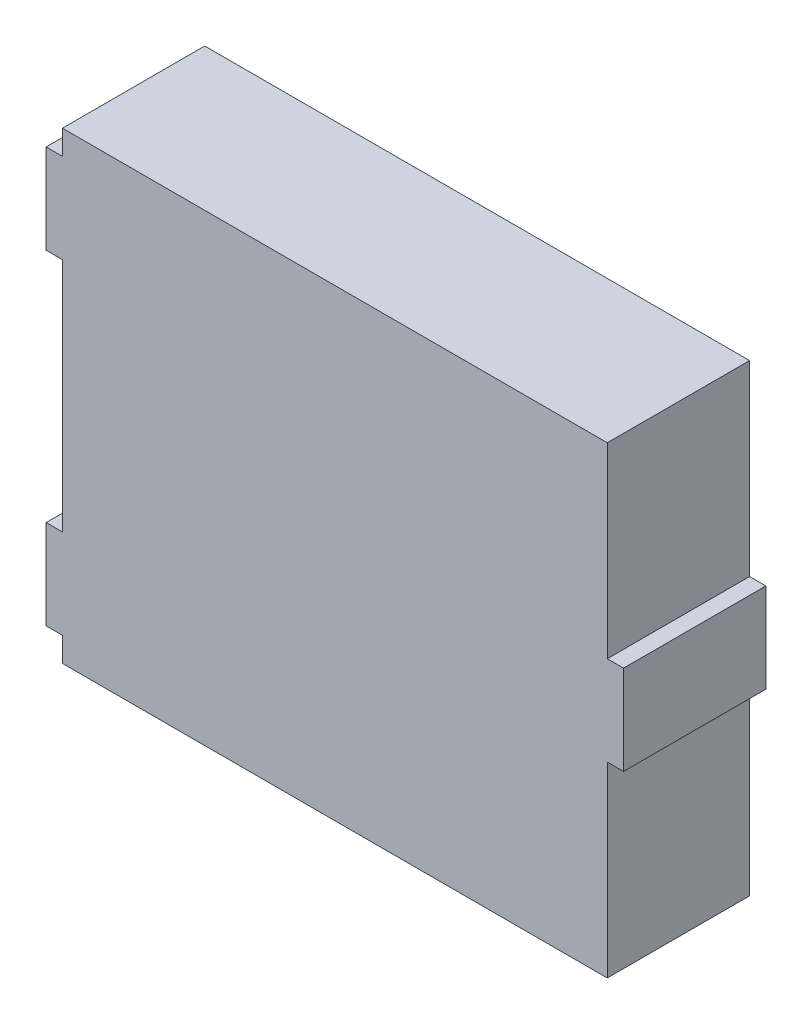
ISO-10303-21;
HEADER;
FILE_DESCRIPTION(('STEP AP214'),'2;1');
FILE_NAME('part.step','',(''),(''),'','','');
FILE_SCHEMA(('AUTOMOTIVE_DESIGN { 1 0 10303 214 1 1 1 1 }'));
ENDSEC;
DATA;
#1=APPLICATION_CONTEXT('core data for automotive mechanical design processes');
#2=APPLICATION_PROTOCOL_DEFINITION('international standard','automotive_design',2000,#1);
#3=PRODUCT_CONTEXT('',#1,'mechanical');
#4=PRODUCT('Part','Part','',(#3));
#5=PRODUCT_RELATED_PRODUCT_CATEGORY('part','',(#4));
#6=PRODUCT_DEFINITION_FORMATION('','',#4);
#7=PRODUCT_DEFINITION_CONTEXT('part definition',#1,'design');
#8=PRODUCT_DEFINITION('design','',#6,#7);
#9=PRODUCT_DEFINITION_SHAPE('','',#8);
#10=(LENGTH_UNIT() NAMED_UNIT(*) SI_UNIT(.MILLI.,.METRE.));
#11=(NAMED_UNIT(*) PLANE_ANGLE_UNIT() SI_UNIT($,.RADIAN.));
#12=(NAMED_UNIT(*) SI_UNIT($,.STERADIAN.) SOLID_ANGLE_UNIT());
#13=UNCERTAINTY_MEASURE_WITH_UNIT(LENGTH_MEASURE(1.E-05),#10,'distance_accuracy_value','');
#14=(GEOMETRIC_REPRESENTATION_CONTEXT(3) GLOBAL_UNCERTAINTY_ASSIGNED_CONTEXT((#13)) GLOBAL_UNIT_ASSIGNED_CONTEXT((#10,
#11,#12)) REPRESENTATION_CONTEXT('',''));
#15=CARTESIAN_POINT('',(0.,0.,0.));
#16=DIRECTION('',(0.,0.,1.));
#17=DIRECTION('',(1.,0.,0.));
#18=AXIS2_PLACEMENT_3D('',#15,#16,#17);
#19=CARTESIAN_POINT('',(3.35,-2.85,1.75));
#20=DIRECTION('',(0.,1.,0.));
#21=DIRECTION('',(0.,0.,1.));
#22=AXIS2_PLACEMENT_3D('',#19,#20,#21);
#23=PLANE('',#22);
#24=DIRECTION('',(1.,0.,0.));
#25=VECTOR('',#24,1.);
#26=CARTESIAN_POINT('',(3.35,-2.85,0.));
#27=LINE('',#26,#25);
#28=CARTESIAN_POINT('',(-3.35,-2.85,0.));
#29=VERTEX_POINT('',#28);
#30=CARTESIAN_POINT('',(3.35,-2.85,0.));
#31=VERTEX_POINT('',#30);
#32=EDGE_CURVE('E178',#29,#31,#27,.T.);
#33=ORIENTED_EDGE('',*,*,#32,.T.);
#34=DIRECTION('',(0.,0.,-1.));
#35=VECTOR('',#34,1.);
#36=CARTESIAN_POINT('',(3.35,-2.85,1.75));
#37=LINE('',#36,#35);
#38=CARTESIAN_POINT('',(3.35,-2.85,1.75));
#39=VERTEX_POINT('',#38);
#40=EDGE_CURVE('E11',#39,#31,#37,.T.);
#41=ORIENTED_EDGE('',*,*,#40,.F.);
#42=DIRECTION('',(1.,0.,0.));
#43=VECTOR('',#42,1.);
#44=CARTESIAN_POINT('',(3.35,-2.85,1.75));
#45=LINE('',#44,#43);
#46=CARTESIAN_POINT('',(-3.35,-2.85,1.75));
#47=VERTEX_POINT('',#46);
#48=EDGE_CURVE('E208',#47,#39,#45,.T.);
#49=ORIENTED_EDGE('',*,*,#48,.F.);
#50=DIRECTION('',(0.,0.,-1.));
#51=VECTOR('',#50,1.);
#52=CARTESIAN_POINT('',(-3.35,-2.85,1.75));
#53=LINE('',#52,#51);
#54=EDGE_CURVE('E174',#47,#29,#53,.T.);
#55=ORIENTED_EDGE('',*,*,#54,.T.);
#56=EDGE_LOOP('',(#33,#41,#49,#55));
#57=FACE_BOUND('',#56,.T.);
#58=ADVANCED_FACE('F34',(#57),#23,.F.);
#59=CARTESIAN_POINT('',(3.35,-0.55,1.75));
#60=DIRECTION('',(-1.,0.,0.));
#61=DIRECTION('',(0.,0.,1.));
#62=AXIS2_PLACEMENT_3D('',#59,#60,#61);
#63=PLANE('',#62);
#64=DIRECTION('',(0.,1.,0.));
#65=VECTOR('',#64,1.);
#66=CARTESIAN_POINT('',(3.35,-0.55,0.));
#67=LINE('',#66,#65);
#68=CARTESIAN_POINT('',(3.35,-0.55,0.));
#69=VERTEX_POINT('',#68);
#70=EDGE_CURVE('E181',#31,#69,#67,.T.);
#71=ORIENTED_EDGE('',*,*,#70,.T.);
#72=DIRECTION('',(0.,0.,-1.));
#73=VECTOR('',#72,1.);
#74=CARTESIAN_POINT('',(3.35,-0.55,1.75));
#75=LINE('',#74,#73);
#76=CARTESIAN_POINT('',(3.35,-0.55,1.75));
#77=VERTEX_POINT('',#76);
#78=EDGE_CURVE('E42',#77,#69,#75,.T.);
#79=ORIENTED_EDGE('',*,*,#78,.F.);
#80=DIRECTION('',(0.,1.,0.));
#81=VECTOR('',#80,1.);
#82=CARTESIAN_POINT('',(3.35,-0.55,1.75));
#83=LINE('',#82,#81);
#84=EDGE_CURVE('E117',#39,#77,#83,.T.);
#85=ORIENTED_EDGE('',*,*,#84,.F.);
#86=ORIENTED_EDGE('',*,*,#40,.T.);
#87=EDGE_LOOP('',(#71,#79,#85,#86));
#88=FACE_BOUND('',#87,.T.);
#89=ADVANCED_FACE('F306',(#88),#63,.F.);
#90=CARTESIAN_POINT('',(3.55,-0.55,1.75));
#91=DIRECTION('',(0.,1.,0.));
#92=DIRECTION('',(0.,0.,1.));
#93=AXIS2_PLACEMENT_3D('',#90,#91,#92);
#94=PLANE('',#93);
#95=DIRECTION('',(1.,0.,0.));
#96=VECTOR('',#95,1.);
#97=CARTESIAN_POINT('',(3.55,-0.55,0.));
#98=LINE('',#97,#96);
#99=CARTESIAN_POINT('',(3.55,-0.55,0.));
#100=VERTEX_POINT('',#99);
#101=EDGE_CURVE('E183',#69,#100,#98,.T.);
#102=ORIENTED_EDGE('',*,*,#101,.T.);
#103=DIRECTION('',(0.,0.,-1.));
#104=VECTOR('',#103,1.);
#105=CARTESIAN_POINT('',(3.55,-0.55,1.75));
#106=LINE('',#105,#104);
#107=CARTESIAN_POINT('',(3.55,-0.55,1.75));
#108=VERTEX_POINT('',#107);
#109=EDGE_CURVE('E239',#108,#100,#106,.T.);
#110=ORIENTED_EDGE('',*,*,#109,.F.);
#111=DIRECTION('',(1.,0.,0.));
#112=VECTOR('',#111,1.);
#113=CARTESIAN_POINT('',(3.55,-0.55,1.75));
#114=LINE('',#113,#112);
#115=EDGE_CURVE('E247',#77,#108,#114,.T.);
#116=ORIENTED_EDGE('',*,*,#115,.F.);
#117=ORIENTED_EDGE('',*,*,#78,.T.);
#118=EDGE_LOOP('',(#102,#110,#116,#117));
#119=FACE_BOUND('',#118,.T.);
#120=ADVANCED_FACE('F245',(#119),#94,.F.);
#121=CARTESIAN_POINT('',(3.55,0.55,1.75));
#122=DIRECTION('',(-1.,0.,0.));
#123=DIRECTION('',(0.,0.,1.));
#124=AXIS2_PLACEMENT_3D('',#121,#122,#123);
#125=PLANE('',#124);
#126=DIRECTION('',(0.,1.,0.));
#127=VECTOR('',#126,1.);
#128=CARTESIAN_POINT('',(3.55,0.55,0.));
#129=LINE('',#128,#127);
#130=CARTESIAN_POINT('',(3.55,0.55,0.));
#131=VERTEX_POINT('',#130);
#132=EDGE_CURVE('E185',#100,#131,#129,.T.);
#133=ORIENTED_EDGE('',*,*,#132,.T.);
#134=DIRECTION('',(0.,0.,-1.));
#135=VECTOR('',#134,1.);
#136=CARTESIAN_POINT('',(3.55,0.55,1.75));
#137=LINE('',#136,#135);
#138=CARTESIAN_POINT('',(3.55,0.55,1.75));
#139=VERTEX_POINT('',#138);
#140=EDGE_CURVE('E236',#139,#131,#137,.T.);
#141=ORIENTED_EDGE('',*,*,#140,.F.);
#142=DIRECTION('',(0.,1.,0.));
#143=VECTOR('',#142,1.);
#144=CARTESIAN_POINT('',(3.55,0.55,1.75));
#145=LINE('',#144,#143);
#146=EDGE_CURVE('E265',#108,#139,#145,.T.);
#147=ORIENTED_EDGE('',*,*,#146,.F.);
#148=ORIENTED_EDGE('',*,*,#109,.T.);
#149=EDGE_LOOP('',(#133,#141,#147,#148));
#150=FACE_BOUND('',#149,.T.);
#151=ADVANCED_FACE('F256',(#150),#125,.F.);
#152=CARTESIAN_POINT('',(3.35,0.55,1.75));
#153=DIRECTION('',(0.,-1.,0.));
#154=DIRECTION('',(0.,0.,-1.));
#155=AXIS2_PLACEMENT_3D('',#152,#153,#154);
#156=PLANE('',#155);
#157=DIRECTION('',(-1.,0.,0.));
#158=VECTOR('',#157,1.);
#159=CARTESIAN_POINT('',(3.35,0.55,0.));
#160=LINE('',#159,#158);
#161=CARTESIAN_POINT('',(3.35,0.55,0.));
#162=VERTEX_POINT('',#161);
#163=EDGE_CURVE('E187',#131,#162,#160,.T.);
#164=ORIENTED_EDGE('',*,*,#163,.T.);
#165=DIRECTION('',(0.,0.,-1.));
#166=VECTOR('',#165,1.);
#167=CARTESIAN_POINT('',(3.35,0.55,1.75));
#168=LINE('',#167,#166);
#169=CARTESIAN_POINT('',(3.35,0.55,1.75));
#170=VERTEX_POINT('',#169);
#171=EDGE_CURVE('E233',#170,#162,#168,.T.);
#172=ORIENTED_EDGE('',*,*,#171,.F.);
#173=DIRECTION('',(-1.,0.,0.));
#174=VECTOR('',#173,1.);
#175=CARTESIAN_POINT('',(3.35,0.55,1.75));
#176=LINE('',#175,#174);
#177=EDGE_CURVE('E262',#139,#170,#176,.T.);
#178=ORIENTED_EDGE('',*,*,#177,.F.);
#179=ORIENTED_EDGE('',*,*,#140,.T.);
#180=EDGE_LOOP('',(#164,#172,#178,#179));
#181=FACE_BOUND('',#180,.T.);
#182=ADVANCED_FACE('F260',(#181),#156,.F.);
#183=CARTESIAN_POINT('',(3.35,2.85,1.75));
#184=DIRECTION('',(-1.,0.,0.));
#185=DIRECTION('',(0.,0.,1.));
#186=AXIS2_PLACEMENT_3D('',#183,#184,#185);
#187=PLANE('',#186);
#188=DIRECTION('',(0.,1.,0.));
#189=VECTOR('',#188,1.);
#190=CARTESIAN_POINT('',(3.35,2.85,0.));
#191=LINE('',#190,#189);
#192=CARTESIAN_POINT('',(3.35,2.85,0.));
#193=VERTEX_POINT('',#192);
#194=EDGE_CURVE('E189',#162,#193,#191,.T.);
#195=ORIENTED_EDGE('',*,*,#194,.T.);
#196=DIRECTION('',(0.,0.,-1.));
#197=VECTOR('',#196,1.);
#198=CARTESIAN_POINT('',(3.35,2.85,1.75));
#199=LINE('',#198,#197);
#200=CARTESIAN_POINT('',(3.35,2.85,1.75));
#201=VERTEX_POINT('',#200);
#202=EDGE_CURVE('E230',#201,#193,#199,.T.);
#203=ORIENTED_EDGE('',*,*,#202,.F.);
#204=DIRECTION('',(0.,1.,0.));
#205=VECTOR('',#204,1.);
#206=CARTESIAN_POINT('',(3.35,2.85,1.75));
#207=LINE('',#206,#205);
#208=EDGE_CURVE('E264',#170,#201,#207,.T.);
#209=ORIENTED_EDGE('',*,*,#208,.F.);
#210=ORIENTED_EDGE('',*,*,#171,.T.);
#211=EDGE_LOOP('',(#195,#203,#209,#210));
#212=FACE_BOUND('',#211,.T.);
#213=ADVANCED_FACE('F319',(#212),#187,.F.);
#214=CARTESIAN_POINT('',(-3.35,2.85,1.75));
#215=DIRECTION('',(0.,-1.,0.));
#216=DIRECTION('',(0.,0.,-1.));
#217=AXIS2_PLACEMENT_3D('',#214,#215,#216);
#218=PLANE('',#217);
#219=DIRECTION('',(-1.,0.,0.));
#220=VECTOR('',#219,1.);
#221=CARTESIAN_POINT('',(-3.35,2.85,0.));
#222=LINE('',#221,#220);
#223=CARTESIAN_POINT('',(-3.35,2.85,0.));
#224=VERTEX_POINT('',#223);
#225=EDGE_CURVE('E191',#193,#224,#222,.T.);
#226=ORIENTED_EDGE('',*,*,#225,.T.);
#227=DIRECTION('',(0.,0.,-1.));
#228=VECTOR('',#227,1.);
#229=CARTESIAN_POINT('',(-3.35,2.85,1.75));
#230=LINE('',#229,#228);
#231=CARTESIAN_POINT('',(-3.35,2.85,1.75));
#232=VERTEX_POINT('',#231);
#233=EDGE_CURVE('E227',#232,#224,#230,.T.);
#234=ORIENTED_EDGE('',*,*,#233,.F.);
#235=DIRECTION('',(-1.,0.,0.));
#236=VECTOR('',#235,1.);
#237=CARTESIAN_POINT('',(-3.35,2.85,1.75));
#238=LINE('',#237,#236);
#239=EDGE_CURVE('E267',#201,#232,#238,.T.);
#240=ORIENTED_EDGE('',*,*,#239,.F.);
#241=ORIENTED_EDGE('',*,*,#202,.T.);
#242=EDGE_LOOP('',(#226,#234,#240,#241));
#243=FACE_BOUND('',#242,.T.);
#244=ADVANCED_FACE('F322',(#243),#218,.F.);
#245=CARTESIAN_POINT('',(-3.35,2.55,1.75));
#246=DIRECTION('',(1.,0.,0.));
#247=DIRECTION('',(0.,0.,-1.));
#248=AXIS2_PLACEMENT_3D('',#245,#246,#247);
#249=PLANE('',#248);
#250=DIRECTION('',(0.,-1.,0.));
#251=VECTOR('',#250,1.);
#252=CARTESIAN_POINT('',(-3.35,2.55,0.));
#253=LINE('',#252,#251);
#254=CARTESIAN_POINT('',(-3.35,2.55,0.));
#255=VERTEX_POINT('',#254);
#256=EDGE_CURVE('E193',#224,#255,#253,.T.);
#257=ORIENTED_EDGE('',*,*,#256,.T.);
#258=DIRECTION('',(0.,0.,-1.));
#259=VECTOR('',#258,1.);
#260=CARTESIAN_POINT('',(-3.35,2.55,1.75));
#261=LINE('',#260,#259);
#262=CARTESIAN_POINT('',(-3.35,2.55,1.75));
#263=VERTEX_POINT('',#262);
#264=EDGE_CURVE('E224',#263,#255,#261,.T.);
#265=ORIENTED_EDGE('',*,*,#264,.F.);
#266=DIRECTION('',(0.,-1.,0.));
#267=VECTOR('',#266,1.);
#268=CARTESIAN_POINT('',(-3.35,2.55,1.75));
#269=LINE('',#268,#267);
#270=EDGE_CURVE('E273',#232,#263,#269,.T.);
#271=ORIENTED_EDGE('',*,*,#270,.F.);
#272=ORIENTED_EDGE('',*,*,#233,.T.);
#273=EDGE_LOOP('',(#257,#265,#271,#272));
#274=FACE_BOUND('',#273,.T.);
#275=ADVANCED_FACE('F326',(#274),#249,.F.);
#276=CARTESIAN_POINT('',(-3.55,2.55,1.75));
#277=DIRECTION('',(0.,-1.,0.));
#278=DIRECTION('',(0.,0.,-1.));
#279=AXIS2_PLACEMENT_3D('',#276,#277,#278);
#280=PLANE('',#279);
#281=DIRECTION('',(-1.,0.,0.));
#282=VECTOR('',#281,1.);
#283=CARTESIAN_POINT('',(-3.55,2.55,0.));
#284=LINE('',#283,#282);
#285=CARTESIAN_POINT('',(-3.55,2.55,0.));
#286=VERTEX_POINT('',#285);
#287=EDGE_CURVE('E195',#255,#286,#284,.T.);
#288=ORIENTED_EDGE('',*,*,#287,.T.);
#289=DIRECTION('',(0.,0.,-1.));
#290=VECTOR('',#289,1.);
#291=CARTESIAN_POINT('',(-3.55,2.55,1.75));
#292=LINE('',#291,#290);
#293=CARTESIAN_POINT('',(-3.55,2.55,1.75));
#294=VERTEX_POINT('',#293);
#295=EDGE_CURVE('E221',#294,#286,#292,.T.);
#296=ORIENTED_EDGE('',*,*,#295,.F.);
#297=DIRECTION('',(-1.,0.,0.));
#298=VECTOR('',#297,1.);
#299=CARTESIAN_POINT('',(-3.55,2.55,1.75));
#300=LINE('',#299,#298);
#301=EDGE_CURVE('E275',#263,#294,#300,.T.);
#302=ORIENTED_EDGE('',*,*,#301,.F.);
#303=ORIENTED_EDGE('',*,*,#264,.T.);
#304=EDGE_LOOP('',(#288,#296,#302,#303));
#305=FACE_BOUND('',#304,.T.);
#306=ADVANCED_FACE('F330',(#305),#280,.F.);
#307=CARTESIAN_POINT('',(-3.55,1.45,1.75));
#308=DIRECTION('',(1.,0.,0.));
#309=DIRECTION('',(0.,0.,-1.));
#310=AXIS2_PLACEMENT_3D('',#307,#308,#309);
#311=PLANE('',#310);
#312=DIRECTION('',(0.,-1.,0.));
#313=VECTOR('',#312,1.);
#314=CARTESIAN_POINT('',(-3.55,1.45,0.));
#315=LINE('',#314,#313);
#316=CARTESIAN_POINT('',(-3.55,1.45,0.));
#317=VERTEX_POINT('',#316);
#318=EDGE_CURVE('E197',#286,#317,#315,.T.);
#319=ORIENTED_EDGE('',*,*,#318,.T.);
#320=DIRECTION('',(0.,0.,-1.));
#321=VECTOR('',#320,1.);
#322=CARTESIAN_POINT('',(-3.55,1.45,1.75));
#323=LINE('',#322,#321);
#324=CARTESIAN_POINT('',(-3.55,1.45,1.75));
#325=VERTEX_POINT('',#324);
#326=EDGE_CURVE('E218',#325,#317,#323,.T.);
#327=ORIENTED_EDGE('',*,*,#326,.F.);
#328=DIRECTION('',(0.,-1.,0.));
#329=VECTOR('',#328,1.);
#330=CARTESIAN_POINT('',(-3.55,1.45,1.75));
#331=LINE('',#330,#329);
#332=EDGE_CURVE('E277',#294,#325,#331,.T.);
#333=ORIENTED_EDGE('',*,*,#332,.F.);
#334=ORIENTED_EDGE('',*,*,#295,.T.);
#335=EDGE_LOOP('',(#319,#327,#333,#334));
#336=FACE_BOUND('',#335,.T.);
#337=ADVANCED_FACE('F334',(#336),#311,.F.);
#338=CARTESIAN_POINT('',(-3.35,1.45,1.75));
#339=DIRECTION('',(0.,1.,0.));
#340=DIRECTION('',(0.,0.,1.));
#341=AXIS2_PLACEMENT_3D('',#338,#339,#340);
#342=PLANE('',#341);
#343=DIRECTION('',(1.,0.,0.));
#344=VECTOR('',#343,1.);
#345=CARTESIAN_POINT('',(-3.35,1.45,0.));
#346=LINE('',#345,#344);
#347=CARTESIAN_POINT('',(-3.35,1.45,0.));
#348=VERTEX_POINT('',#347);
#349=EDGE_CURVE('E199',#317,#348,#346,.T.);
#350=ORIENTED_EDGE('',*,*,#349,.T.);
#351=DIRECTION('',(0.,0.,-1.));
#352=VECTOR('',#351,1.);
#353=CARTESIAN_POINT('',(-3.35,1.45,1.75));
#354=LINE('',#353,#352);
#355=CARTESIAN_POINT('',(-3.35,1.45,1.75));
#356=VERTEX_POINT('',#355);
#357=EDGE_CURVE('E215',#356,#348,#354,.T.);
#358=ORIENTED_EDGE('',*,*,#357,.F.);
#359=DIRECTION('',(1.,0.,0.));
#360=VECTOR('',#359,1.);
#361=CARTESIAN_POINT('',(-3.35,1.45,1.75));
#362=LINE('',#361,#360);
#363=EDGE_CURVE('E279',#325,#356,#362,.T.);
#364=ORIENTED_EDGE('',*,*,#363,.F.);
#365=ORIENTED_EDGE('',*,*,#326,.T.);
#366=EDGE_LOOP('',(#350,#358,#364,#365));
#367=FACE_BOUND('',#366,.T.);
#368=ADVANCED_FACE('F338',(#367),#342,.F.);
#369=CARTESIAN_POINT('',(-3.35,-1.45,1.75));
#370=DIRECTION('',(1.,0.,0.));
#371=DIRECTION('',(0.,0.,-1.));
#372=AXIS2_PLACEMENT_3D('',#369,#370,#371);
#373=PLANE('',#372);
#374=DIRECTION('',(0.,-1.,0.));
#375=VECTOR('',#374,1.);
#376=CARTESIAN_POINT('',(-3.35,-1.45,0.));
#377=LINE('',#376,#375);
#378=CARTESIAN_POINT('',(-3.35,-1.45,0.));
#379=VERTEX_POINT('',#378);
#380=EDGE_CURVE('E201',#348,#379,#377,.T.);
#381=ORIENTED_EDGE('',*,*,#380,.T.);
#382=DIRECTION('',(0.,0.,-1.));
#383=VECTOR('',#382,1.);
#384=CARTESIAN_POINT('',(-3.35,-1.45,1.75));
#385=LINE('',#384,#383);
#386=CARTESIAN_POINT('',(-3.35,-1.45,1.75));
#387=VERTEX_POINT('',#386);
#388=EDGE_CURVE('E212',#387,#379,#385,.T.);
#389=ORIENTED_EDGE('',*,*,#388,.F.);
#390=DIRECTION('',(0.,-1.,0.));
#391=VECTOR('',#390,1.);
#392=CARTESIAN_POINT('',(-3.35,-1.45,1.75));
#393=LINE('',#392,#391);
#394=EDGE_CURVE('E281',#356,#387,#393,.T.);
#395=ORIENTED_EDGE('',*,*,#394,.F.);
#396=ORIENTED_EDGE('',*,*,#357,.T.);
#397=EDGE_LOOP('',(#381,#389,#395,#396));
#398=FACE_BOUND('',#397,.T.);
#399=ADVANCED_FACE('F287',(#398),#373,.F.);
#400=CARTESIAN_POINT('',(-3.55,-1.45,1.75));
#401=DIRECTION('',(0.,-1.,0.));
#402=DIRECTION('',(0.,0.,-1.));
#403=AXIS2_PLACEMENT_3D('',#400,#401,#402);
#404=PLANE('',#403);
#405=DIRECTION('',(-1.,0.,0.));
#406=VECTOR('',#405,1.);
#407=CARTESIAN_POINT('',(-3.55,-1.45,0.));
#408=LINE('',#407,#406);
#409=CARTESIAN_POINT('',(-3.55,-1.45,0.));
#410=VERTEX_POINT('',#409);
#411=EDGE_CURVE('E203',#379,#410,#408,.T.);
#412=ORIENTED_EDGE('',*,*,#411,.T.);
#413=DIRECTION('',(0.,0.,-1.));
#414=VECTOR('',#413,1.);
#415=CARTESIAN_POINT('',(-3.55,-1.45,1.75));
#416=LINE('',#415,#414);
#417=CARTESIAN_POINT('',(-3.55,-1.45,1.75));
#418=VERTEX_POINT('',#417);
#419=EDGE_CURVE('E169',#418,#410,#416,.T.);
#420=ORIENTED_EDGE('',*,*,#419,.F.);
#421=DIRECTION('',(-1.,0.,0.));
#422=VECTOR('',#421,1.);
#423=CARTESIAN_POINT('',(-3.55,-1.45,1.75));
#424=LINE('',#423,#422);
#425=EDGE_CURVE('E160',#387,#418,#424,.T.);
#426=ORIENTED_EDGE('',*,*,#425,.F.);
#427=ORIENTED_EDGE('',*,*,#388,.T.);
#428=EDGE_LOOP('',(#412,#420,#426,#427));
#429=FACE_BOUND('',#428,.T.);
#430=ADVANCED_FACE('F291',(#429),#404,.F.);
#431=CARTESIAN_POINT('',(-3.55,-2.55,1.75));
#432=DIRECTION('',(1.,0.,0.));
#433=DIRECTION('',(0.,0.,-1.));
#434=AXIS2_PLACEMENT_3D('',#431,#432,#433);
#435=PLANE('',#434);
#436=DIRECTION('',(0.,-1.,0.));
#437=VECTOR('',#436,1.);
#438=CARTESIAN_POINT('',(-3.55,-2.55,0.));
#439=LINE('',#438,#437);
#440=CARTESIAN_POINT('',(-3.55,-2.55,0.));
#441=VERTEX_POINT('',#440);
#442=EDGE_CURVE('E168',#410,#441,#439,.T.);
#443=ORIENTED_EDGE('',*,*,#442,.T.);
#444=DIRECTION('',(0.,0.,-1.));
#445=VECTOR('',#444,1.);
#446=CARTESIAN_POINT('',(-3.55,-2.55,1.75));
#447=LINE('',#446,#445);
#448=CARTESIAN_POINT('',(-3.55,-2.55,1.75));
#449=VERTEX_POINT('',#448);
#450=EDGE_CURVE('E165',#449,#441,#447,.T.);
#451=ORIENTED_EDGE('',*,*,#450,.F.);
#452=DIRECTION('',(0.,-1.,0.));
#453=VECTOR('',#452,1.);
#454=CARTESIAN_POINT('',(-3.55,-2.55,1.75));
#455=LINE('',#454,#453);
#456=EDGE_CURVE('E154',#418,#449,#455,.T.);
#457=ORIENTED_EDGE('',*,*,#456,.F.);
#458=ORIENTED_EDGE('',*,*,#419,.T.);
#459=EDGE_LOOP('',(#443,#451,#457,#458));
#460=FACE_BOUND('',#459,.T.);
#461=ADVANCED_FACE('F166',(#460),#435,.F.);
#462=CARTESIAN_POINT('',(-3.35,-2.55,1.75));
#463=DIRECTION('',(0.,1.,0.));
#464=DIRECTION('',(0.,0.,1.));
#465=AXIS2_PLACEMENT_3D('',#462,#463,#464);
#466=PLANE('',#465);
#467=DIRECTION('',(1.,0.,0.));
#468=VECTOR('',#467,1.);
#469=CARTESIAN_POINT('',(-3.35,-2.55,0.));
#470=LINE('',#469,#468);
#471=CARTESIAN_POINT('',(-3.35,-2.55,0.));
#472=VERTEX_POINT('',#471);
#473=EDGE_CURVE('E103',#441,#472,#470,.T.);
#474=ORIENTED_EDGE('',*,*,#473,.T.);
#475=DIRECTION('',(0.,0.,-1.));
#476=VECTOR('',#475,1.);
#477=CARTESIAN_POINT('',(-3.35,-2.55,1.75));
#478=LINE('',#477,#476);
#479=CARTESIAN_POINT('',(-3.35,-2.55,1.75));
#480=VERTEX_POINT('',#479);
#481=EDGE_CURVE('E170',#480,#472,#478,.T.);
#482=ORIENTED_EDGE('',*,*,#481,.F.);
#483=DIRECTION('',(1.,0.,0.));
#484=VECTOR('',#483,1.);
#485=CARTESIAN_POINT('',(-3.35,-2.55,1.75));
#486=LINE('',#485,#484);
#487=EDGE_CURVE('E158',#449,#480,#486,.T.);
#488=ORIENTED_EDGE('',*,*,#487,.F.);
#489=ORIENTED_EDGE('',*,*,#450,.T.);
#490=EDGE_LOOP('',(#474,#482,#488,#489));
#491=FACE_BOUND('',#490,.T.);
#492=ADVANCED_FACE('F172',(#491),#466,.F.);
#493=CARTESIAN_POINT('',(-3.35,-2.85,1.75));
#494=DIRECTION('',(1.,0.,0.));
#495=DIRECTION('',(0.,0.,-1.));
#496=AXIS2_PLACEMENT_3D('',#493,#494,#495);
#497=PLANE('',#496);
#498=DIRECTION('',(0.,-1.,0.));
#499=VECTOR('',#498,1.);
#500=CARTESIAN_POINT('',(-3.35,-2.85,0.));
#501=LINE('',#500,#499);
#502=EDGE_CURVE('E109',#472,#29,#501,.T.);
#503=ORIENTED_EDGE('',*,*,#502,.T.);
#504=ORIENTED_EDGE('',*,*,#54,.F.);
#505=DIRECTION('',(0.,-1.,0.));
#506=VECTOR('',#505,1.);
#507=CARTESIAN_POINT('',(-3.35,-2.85,1.75));
#508=LINE('',#507,#506);
#509=EDGE_CURVE('E50',#480,#47,#508,.T.);
#510=ORIENTED_EDGE('',*,*,#509,.F.);
#511=ORIENTED_EDGE('',*,*,#481,.T.);
#512=EDGE_LOOP('',(#503,#504,#510,#511));
#513=FACE_BOUND('',#512,.T.);
#514=ADVANCED_FACE('F295',(#513),#497,.F.);
#515=CARTESIAN_POINT('',(0.,0.,1.75));
#516=DIRECTION('',(0.,0.,-1.));
#517=DIRECTION('',(-1.,0.,0.));
#518=AXIS2_PLACEMENT_3D('',#515,#516,#517);
#519=PLANE('',#518);
#520=ORIENTED_EDGE('',*,*,#48,.T.);
#521=ORIENTED_EDGE('',*,*,#84,.T.);
#522=ORIENTED_EDGE('',*,*,#115,.T.);
#523=ORIENTED_EDGE('',*,*,#146,.T.);
#524=ORIENTED_EDGE('',*,*,#177,.T.);
#525=ORIENTED_EDGE('',*,*,#208,.T.);
#526=ORIENTED_EDGE('',*,*,#239,.T.);
#527=ORIENTED_EDGE('',*,*,#270,.T.);
#528=ORIENTED_EDGE('',*,*,#301,.T.);
#529=ORIENTED_EDGE('',*,*,#332,.T.);
#530=ORIENTED_EDGE('',*,*,#363,.T.);
#531=ORIENTED_EDGE('',*,*,#394,.T.);
#532=ORIENTED_EDGE('',*,*,#425,.T.);
#533=ORIENTED_EDGE('',*,*,#456,.T.);
#534=ORIENTED_EDGE('',*,*,#487,.T.);
#535=ORIENTED_EDGE('',*,*,#509,.T.);
#536=EDGE_LOOP('',(#520,#521,#522,#523,#524,#525,#526,#527,#528,#529,#530,#531,#532,#533,#534,#535));
#537=FACE_BOUND('',#536,.T.);
#538=ADVANCED_FACE('F156',(#537),#519,.F.);
#539=CARTESIAN_POINT('',(0.,0.,0.));
#540=DIRECTION('',(0.,0.,-1.));
#541=DIRECTION('',(-1.,0.,0.));
#542=AXIS2_PLACEMENT_3D('',#539,#540,#541);
#543=PLANE('',#542);
#544=ORIENTED_EDGE('',*,*,#32,.F.);
#545=ORIENTED_EDGE('',*,*,#502,.F.);
#546=ORIENTED_EDGE('',*,*,#473,.F.);
#547=ORIENTED_EDGE('',*,*,#442,.F.);
#548=ORIENTED_EDGE('',*,*,#411,.F.);
#549=ORIENTED_EDGE('',*,*,#380,.F.);
#550=ORIENTED_EDGE('',*,*,#349,.F.);
#551=ORIENTED_EDGE('',*,*,#318,.F.);
#552=ORIENTED_EDGE('',*,*,#287,.F.);
#553=ORIENTED_EDGE('',*,*,#256,.F.);
#554=ORIENTED_EDGE('',*,*,#225,.F.);
#555=ORIENTED_EDGE('',*,*,#194,.F.);
#556=ORIENTED_EDGE('',*,*,#163,.F.);
#557=ORIENTED_EDGE('',*,*,#132,.F.);
#558=ORIENTED_EDGE('',*,*,#101,.F.);
#559=ORIENTED_EDGE('',*,*,#70,.F.);
#560=EDGE_LOOP('',(#544,#545,#546,#547,#548,#549,#550,#551,#552,#553,#554,#555,#556,#557,#558,#559));
#561=FACE_BOUND('',#560,.T.);
#562=ADVANCED_FACE('F251',(#561),#543,.T.);
#563=CLOSED_SHELL('',(#58,#89,#120,#151,#182,#213,#244,#275,#306,#337,#368,#399,#430,#461,#492,
#514,#538,#562));
#564=MANIFOLD_SOLID_BREP('B2',#563);
#565=ADVANCED_BREP_SHAPE_REPRESENTATION('',(#18,#564),#14);
#566=SHAPE_DEFINITION_REPRESENTATION(#9,#565);
ENDSEC;
END-ISO-10303-21;
